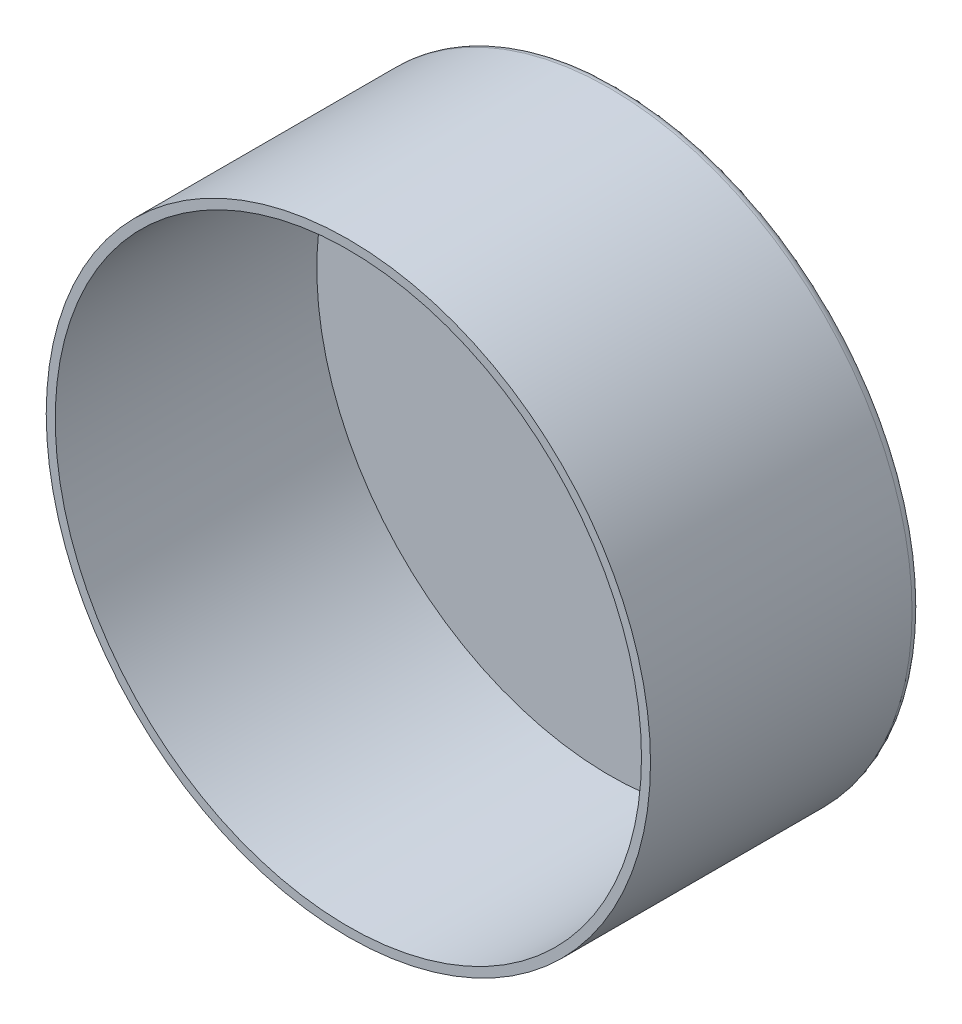
ISO-10303-21;
HEADER;
FILE_DESCRIPTION(('STEP AP214'),'2;1');
FILE_NAME('part.step','',(''),(''),'','','');
FILE_SCHEMA(('AUTOMOTIVE_DESIGN { 1 0 10303 214 1 1 1 1 }'));
ENDSEC;
DATA;
#1=APPLICATION_CONTEXT('core data for automotive mechanical design processes');
#2=APPLICATION_PROTOCOL_DEFINITION('international standard','automotive_design',2000,#1);
#3=PRODUCT_CONTEXT('',#1,'mechanical');
#4=PRODUCT('Part','Part','',(#3));
#5=PRODUCT_RELATED_PRODUCT_CATEGORY('part','',(#4));
#6=PRODUCT_DEFINITION_FORMATION('','',#4);
#7=PRODUCT_DEFINITION_CONTEXT('part definition',#1,'design');
#8=PRODUCT_DEFINITION('design','',#6,#7);
#9=PRODUCT_DEFINITION_SHAPE('','',#8);
#10=(LENGTH_UNIT() NAMED_UNIT(*) SI_UNIT(.MILLI.,.METRE.));
#11=(NAMED_UNIT(*) PLANE_ANGLE_UNIT() SI_UNIT($,.RADIAN.));
#12=(NAMED_UNIT(*) SI_UNIT($,.STERADIAN.) SOLID_ANGLE_UNIT());
#13=UNCERTAINTY_MEASURE_WITH_UNIT(LENGTH_MEASURE(1.E-05),#10,'distance_accuracy_value','');
#14=(GEOMETRIC_REPRESENTATION_CONTEXT(3) GLOBAL_UNCERTAINTY_ASSIGNED_CONTEXT((#13)) GLOBAL_UNIT_ASSIGNED_CONTEXT((#10,
#11,#12)) REPRESENTATION_CONTEXT('',''));
#15=CARTESIAN_POINT('',(0.,0.,0.));
#16=DIRECTION('',(0.,0.,1.));
#17=DIRECTION('',(1.,0.,0.));
#18=AXIS2_PLACEMENT_3D('',#15,#16,#17);
#19=CARTESIAN_POINT('',(0.,0.,15.));
#20=DIRECTION('',(0.,0.,-1.));
#21=DIRECTION('',(-1.,0.,0.));
#22=AXIS2_PLACEMENT_3D('',#19,#20,#21);
#23=CYLINDRICAL_SURFACE('',#22,16.75);
#24=CARTESIAN_POINT('',(0.,0.,0.5));
#25=DIRECTION('',(0.,0.,1.));
#26=DIRECTION('',(1.,0.,0.));
#27=AXIS2_PLACEMENT_3D('',#24,#25,#26);
#28=CIRCLE('',#27,16.75);
#29=CARTESIAN_POINT('',(16.75,0.,0.5));
#30=VERTEX_POINT('',#29);
#31=EDGE_CURVE('E40',#30,#30,#28,.T.);
#32=ORIENTED_EDGE('',*,*,#31,.T.);
#33=EDGE_LOOP('',(#32));
#34=FACE_BOUND('',#33,.T.);
#35=CARTESIAN_POINT('',(0.,0.,15.));
#36=DIRECTION('',(0.,0.,1.));
#37=DIRECTION('',(1.,0.,0.));
#38=AXIS2_PLACEMENT_3D('',#35,#36,#37);
#39=CIRCLE('',#38,16.75);
#40=CARTESIAN_POINT('',(16.75,0.,15.));
#41=VERTEX_POINT('',#40);
#42=EDGE_CURVE('E44',#41,#41,#39,.T.);
#43=ORIENTED_EDGE('',*,*,#42,.F.);
#44=EDGE_LOOP('',(#43));
#45=FACE_BOUND('',#44,.T.);
#46=ADVANCED_FACE('F33',(#34,#45),#23,.T.);
#47=CARTESIAN_POINT('',(0.,0.,15.));
#48=DIRECTION('',(0.,0.,1.));
#49=DIRECTION('',(1.,0.,0.));
#50=AXIS2_PLACEMENT_3D('',#47,#48,#49);
#51=PLANE('',#50);
#52=CARTESIAN_POINT('',(0.,0.,15.));
#53=DIRECTION('',(0.,0.,1.));
#54=DIRECTION('',(1.,0.,0.));
#55=AXIS2_PLACEMENT_3D('',#52,#53,#54);
#56=CIRCLE('',#55,16.25);
#57=CARTESIAN_POINT('',(16.25,0.,15.));
#58=VERTEX_POINT('',#57);
#59=EDGE_CURVE('E48',#58,#58,#56,.T.);
#60=ORIENTED_EDGE('',*,*,#59,.F.);
#61=EDGE_LOOP('',(#60));
#62=FACE_BOUND('',#61,.T.);
#63=ORIENTED_EDGE('',*,*,#42,.T.);
#64=EDGE_LOOP('',(#63));
#65=FACE_BOUND('',#64,.T.);
#66=ADVANCED_FACE('F69',(#62,#65),#51,.T.);
#67=CARTESIAN_POINT('',(0.,0.,0.));
#68=DIRECTION('',(0.,0.,1.));
#69=DIRECTION('',(1.,0.,0.));
#70=AXIS2_PLACEMENT_3D('',#67,#68,#69);
#71=PLANE('',#70);
#72=CARTESIAN_POINT('',(0.,0.,0.));
#73=DIRECTION('',(0.,0.,1.));
#74=DIRECTION('',(1.,0.,0.));
#75=AXIS2_PLACEMENT_3D('',#72,#73,#74);
#76=CIRCLE('',#75,16.25);
#77=CARTESIAN_POINT('',(16.25,0.,0.));
#78=VERTEX_POINT('',#77);
#79=EDGE_CURVE('E10',#78,#78,#76,.F.);
#80=ORIENTED_EDGE('',*,*,#79,.T.);
#81=EDGE_LOOP('',(#80));
#82=FACE_BOUND('',#81,.T.);
#83=ADVANCED_FACE('F61',(#82),#71,.F.);
#84=CARTESIAN_POINT('',(0.,0.,15.));
#85=DIRECTION('',(0.,0.,-1.));
#86=DIRECTION('',(-1.,0.,0.));
#87=AXIS2_PLACEMENT_3D('',#84,#85,#86);
#88=CYLINDRICAL_SURFACE('',#87,16.25);
#89=ORIENTED_EDGE('',*,*,#59,.T.);
#90=EDGE_LOOP('',(#89));
#91=FACE_BOUND('',#90,.T.);
#92=CARTESIAN_POINT('',(0.,0.,0.5));
#93=DIRECTION('',(0.,0.,1.));
#94=DIRECTION('',(1.,0.,0.));
#95=AXIS2_PLACEMENT_3D('',#92,#93,#94);
#96=CIRCLE('',#95,16.25);
#97=CARTESIAN_POINT('',(16.25,0.,0.5));
#98=VERTEX_POINT('',#97);
#99=EDGE_CURVE('E53',#98,#98,#96,.T.);
#100=ORIENTED_EDGE('',*,*,#99,.F.);
#101=EDGE_LOOP('',(#100));
#102=FACE_BOUND('',#101,.T.);
#103=ADVANCED_FACE('F59',(#91,#102),#88,.F.);
#104=CARTESIAN_POINT('',(0.,0.,0.5));
#105=DIRECTION('',(0.,0.,1.));
#106=DIRECTION('',(1.,0.,0.));
#107=AXIS2_PLACEMENT_3D('',#104,#105,#106);
#108=PLANE('',#107);
#109=ORIENTED_EDGE('',*,*,#99,.T.);
#110=EDGE_LOOP('',(#109));
#111=FACE_BOUND('',#110,.T.);
#112=ADVANCED_FACE('F57',(#111),#108,.T.);
#113=CARTESIAN_POINT('',(0.,0.,0.5));
#114=DIRECTION('',(0.,0.,1.));
#115=DIRECTION('',(1.,0.,0.));
#116=AXIS2_PLACEMENT_3D('',#113,#114,#115);
#117=TOROIDAL_SURFACE('',#116,16.25,0.5);
#118=ORIENTED_EDGE('',*,*,#79,.F.);
#119=EDGE_LOOP('',(#118));
#120=FACE_BOUND('',#119,.T.);
#121=ORIENTED_EDGE('',*,*,#31,.F.);
#122=EDGE_LOOP('',(#121));
#123=FACE_BOUND('',#122,.T.);
#124=ADVANCED_FACE('F35',(#120,#123),#117,.T.);
#125=CLOSED_SHELL('',(#46,#66,#83,#103,#112,#124));
#126=MANIFOLD_SOLID_BREP('B2',#125);
#127=ADVANCED_BREP_SHAPE_REPRESENTATION('',(#18,#126),#14);
#128=SHAPE_DEFINITION_REPRESENTATION(#9,#127);
ENDSEC;
END-ISO-10303-21;
